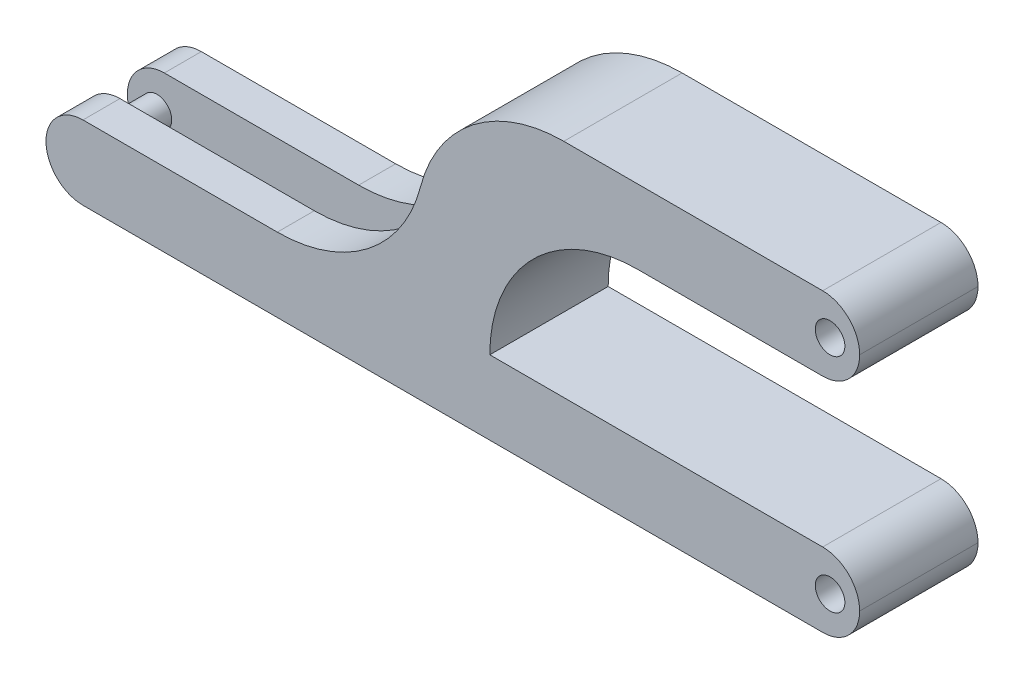
ISO-10303-21;
HEADER;
FILE_DESCRIPTION(('STEP AP214'),'2;1');
FILE_NAME('part.step','',(''),(''),'','','');
FILE_SCHEMA(('AUTOMOTIVE_DESIGN { 1 0 10303 214 1 1 1 1 }'));
ENDSEC;
DATA;
#1=APPLICATION_CONTEXT('core data for automotive mechanical design processes');
#2=APPLICATION_PROTOCOL_DEFINITION('international standard','automotive_design',2000,#1);
#3=PRODUCT_CONTEXT('',#1,'mechanical');
#4=PRODUCT('Part','Part','',(#3));
#5=PRODUCT_RELATED_PRODUCT_CATEGORY('part','',(#4));
#6=PRODUCT_DEFINITION_FORMATION('','',#4);
#7=PRODUCT_DEFINITION_CONTEXT('part definition',#1,'design');
#8=PRODUCT_DEFINITION('design','',#6,#7);
#9=PRODUCT_DEFINITION_SHAPE('','',#8);
#10=(LENGTH_UNIT() NAMED_UNIT(*) SI_UNIT(.MILLI.,.METRE.));
#11=(NAMED_UNIT(*) PLANE_ANGLE_UNIT() SI_UNIT($,.RADIAN.));
#12=(NAMED_UNIT(*) SI_UNIT($,.STERADIAN.) SOLID_ANGLE_UNIT());
#13=UNCERTAINTY_MEASURE_WITH_UNIT(LENGTH_MEASURE(1.E-05),#10,'distance_accuracy_value','');
#14=(GEOMETRIC_REPRESENTATION_CONTEXT(3) GLOBAL_UNCERTAINTY_ASSIGNED_CONTEXT((#13)) GLOBAL_UNIT_ASSIGNED_CONTEXT((#10,
#11,#12)) REPRESENTATION_CONTEXT('',''));
#15=CARTESIAN_POINT('',(0.,0.,0.));
#16=DIRECTION('',(0.,0.,1.));
#17=DIRECTION('',(1.,0.,0.));
#18=AXIS2_PLACEMENT_3D('',#15,#16,#17);
#19=CARTESIAN_POINT('',(0.,-20.,8.));
#20=DIRECTION('',(1.,0.,0.));
#21=DIRECTION('',(0.,1.,0.));
#22=AXIS2_PLACEMENT_3D('',#19,#20,#21);
#23=PLANE('',#22);
#24=DIRECTION('',(0.,-1.,0.));
#25=VECTOR('',#24,1.);
#26=CARTESIAN_POINT('',(0.,-20.,3.));
#27=LINE('',#26,#25);
#28=CARTESIAN_POINT('',(0.,0.,3.));
#29=VERTEX_POINT('',#28);
#30=CARTESIAN_POINT('',(0.,-20.,3.));
#31=VERTEX_POINT('',#30);
#32=EDGE_CURVE('E374',#29,#31,#27,.T.);
#33=ORIENTED_EDGE('',*,*,#32,.F.);
#34=DIRECTION('',(0.,0.,-1.));
#35=VECTOR('',#34,1.);
#36=CARTESIAN_POINT('',(0.,0.,8.));
#37=LINE('',#36,#35);
#38=CARTESIAN_POINT('',(0.,0.,-3.));
#39=VERTEX_POINT('',#38);
#40=EDGE_CURVE('E221',#29,#39,#37,.T.);
#41=ORIENTED_EDGE('',*,*,#40,.T.);
#42=DIRECTION('',(0.,-1.,0.));
#43=VECTOR('',#42,1.);
#44=CARTESIAN_POINT('',(0.,-20.,-3.));
#45=LINE('',#44,#43);
#46=CARTESIAN_POINT('',(0.,-20.,-3.));
#47=VERTEX_POINT('',#46);
#48=EDGE_CURVE('E310',#39,#47,#45,.T.);
#49=ORIENTED_EDGE('',*,*,#48,.T.);
#50=DIRECTION('',(0.,0.,-1.));
#51=VECTOR('',#50,1.);
#52=CARTESIAN_POINT('',(0.,-20.,8.));
#53=LINE('',#52,#51);
#54=EDGE_CURVE('E203',#31,#47,#53,.T.);
#55=ORIENTED_EDGE('',*,*,#54,.F.);
#56=EDGE_LOOP('',(#33,#41,#49,#55));
#57=FACE_BOUND('',#56,.T.);
#58=ADVANCED_FACE('F36',(#57),#23,.F.);
#59=CARTESIAN_POINT('',(0.,0.,8.));
#60=DIRECTION('',(0.,0.,1.));
#61=DIRECTION('',(1.,0.,0.));
#62=AXIS2_PLACEMENT_3D('',#59,#60,#61);
#63=PLANE('',#62);
#64=CARTESIAN_POINT('',(56.,15.,8.));
#65=DIRECTION('',(0.,0.,1.));
#66=DIRECTION('',(1.,0.,0.));
#67=AXIS2_PLACEMENT_3D('',#64,#65,#66);
#68=CIRCLE('',#67,2.);
#69=CARTESIAN_POINT('',(58.,15.,8.));
#70=VERTEX_POINT('',#69);
#71=EDGE_CURVE('E340',#70,#70,#68,.T.);
#72=ORIENTED_EDGE('',*,*,#71,.F.);
#73=EDGE_LOOP('',(#72));
#74=FACE_BOUND('',#73,.T.);
#75=CARTESIAN_POINT('',(55.,15.,8.));
#76=DIRECTION('',(0.,0.,1.));
#77=DIRECTION('',(1.,0.,0.));
#78=AXIS2_PLACEMENT_3D('',#75,#76,#77);
#79=CIRCLE('',#78,5.);
#80=CARTESIAN_POINT('',(55.,10.,8.));
#81=VERTEX_POINT('',#80);
#82=CARTESIAN_POINT('',(60.,15.,8.));
#83=VERTEX_POINT('',#82);
#84=EDGE_CURVE('E283',#81,#83,#79,.T.);
#85=ORIENTED_EDGE('',*,*,#84,.T.);
#86=CARTESIAN_POINT('',(55.,15.,8.));
#87=DIRECTION('',(0.,0.,1.));
#88=DIRECTION('',(1.,0.,0.));
#89=AXIS2_PLACEMENT_3D('',#86,#87,#88);
#90=CIRCLE('',#89,5.);
#91=CARTESIAN_POINT('',(55.,20.,8.));
#92=VERTEX_POINT('',#91);
#93=EDGE_CURVE('E285',#83,#92,#90,.T.);
#94=ORIENTED_EDGE('',*,*,#93,.T.);
#95=DIRECTION('',(-1.,0.,0.));
#96=VECTOR('',#95,1.);
#97=CARTESIAN_POINT('',(60.,20.,8.));
#98=LINE('',#97,#96);
#99=CARTESIAN_POINT('',(19.9999999999999,20.,8.));
#100=VERTEX_POINT('',#99);
#101=EDGE_CURVE('E348',#92,#100,#98,.T.);
#102=ORIENTED_EDGE('',*,*,#101,.T.);
#103=CARTESIAN_POINT('',(19.9999999999999,0.,8.));
#104=DIRECTION('',(0.,0.,1.));
#105=DIRECTION('',(1.,0.,0.));
#106=AXIS2_PLACEMENT_3D('',#103,#104,#105);
#107=CIRCLE('',#106,20.);
#108=CARTESIAN_POINT('',(0.63508326896286,5.,8.));
#109=VERTEX_POINT('',#108);
#110=EDGE_CURVE('E230',#100,#109,#107,.T.);
#111=ORIENTED_EDGE('',*,*,#110,.T.);
#112=CARTESIAN_POINT('',(-18.7298334620742,10.,8.));
#113=DIRECTION('',(0.,0.,1.));
#114=DIRECTION('',(1.,0.,0.));
#115=AXIS2_PLACEMENT_3D('',#112,#113,#114);
#116=CIRCLE('',#115,20.);
#117=CARTESIAN_POINT('',(-18.7298334620742,-10.,8.));
#118=VERTEX_POINT('',#117);
#119=EDGE_CURVE('E252',#109,#118,#116,.F.);
#120=ORIENTED_EDGE('',*,*,#119,.T.);
#121=DIRECTION('',(1.,0.,0.));
#122=VECTOR('',#121,1.);
#123=CARTESIAN_POINT('',(-50.,-10.,8.));
#124=LINE('',#123,#122);
#125=CARTESIAN_POINT('',(-45.,-10.,8.));
#126=VERTEX_POINT('',#125);
#127=EDGE_CURVE('E330',#126,#118,#124,.T.);
#128=ORIENTED_EDGE('',*,*,#127,.F.);
#129=CARTESIAN_POINT('',(-45.,-15.,8.));
#130=DIRECTION('',(0.,0.,1.));
#131=DIRECTION('',(1.,0.,0.));
#132=AXIS2_PLACEMENT_3D('',#129,#130,#131);
#133=CIRCLE('',#132,5.);
#134=CARTESIAN_POINT('',(-50.,-15.,8.));
#135=VERTEX_POINT('',#134);
#136=EDGE_CURVE('E275',#126,#135,#133,.T.);
#137=ORIENTED_EDGE('',*,*,#136,.T.);
#138=CARTESIAN_POINT('',(-45.,-15.,8.));
#139=DIRECTION('',(0.,0.,1.));
#140=DIRECTION('',(1.,0.,0.));
#141=AXIS2_PLACEMENT_3D('',#138,#139,#140);
#142=CIRCLE('',#141,5.);
#143=CARTESIAN_POINT('',(-45.,-20.,8.));
#144=VERTEX_POINT('',#143);
#145=EDGE_CURVE('E277',#135,#144,#142,.T.);
#146=ORIENTED_EDGE('',*,*,#145,.T.);
#147=DIRECTION('',(1.,0.,0.));
#148=VECTOR('',#147,1.);
#149=CARTESIAN_POINT('',(60.,-20.,8.));
#150=LINE('',#149,#148);
#151=CARTESIAN_POINT('',(55.,-20.,8.));
#152=VERTEX_POINT('',#151);
#153=EDGE_CURVE('E350',#144,#152,#150,.T.);
#154=ORIENTED_EDGE('',*,*,#153,.T.);
#155=CARTESIAN_POINT('',(55.,-15.,8.));
#156=DIRECTION('',(0.,0.,1.));
#157=DIRECTION('',(1.,0.,0.));
#158=AXIS2_PLACEMENT_3D('',#155,#156,#157);
#159=CIRCLE('',#158,5.);
#160=CARTESIAN_POINT('',(60.,-15.,8.));
#161=VERTEX_POINT('',#160);
#162=EDGE_CURVE('E281',#152,#161,#159,.T.);
#163=ORIENTED_EDGE('',*,*,#162,.T.);
#164=CARTESIAN_POINT('',(55.,-15.,8.));
#165=DIRECTION('',(0.,0.,1.));
#166=DIRECTION('',(1.,0.,0.));
#167=AXIS2_PLACEMENT_3D('',#164,#165,#166);
#168=CIRCLE('',#167,5.);
#169=CARTESIAN_POINT('',(55.,-10.,8.));
#170=VERTEX_POINT('',#169);
#171=EDGE_CURVE('E279',#161,#170,#168,.T.);
#172=ORIENTED_EDGE('',*,*,#171,.T.);
#173=DIRECTION('',(-1.,0.,0.));
#174=VECTOR('',#173,1.);
#175=CARTESIAN_POINT('',(60.,-10.,8.));
#176=LINE('',#175,#174);
#177=CARTESIAN_POINT('',(9.99999999999999,-10.,8.));
#178=VERTEX_POINT('',#177);
#179=EDGE_CURVE('E210',#170,#178,#176,.T.);
#180=ORIENTED_EDGE('',*,*,#179,.T.);
#181=CARTESIAN_POINT('',(29.9999999999999,-10.,8.));
#182=DIRECTION('',(0.,0.,1.));
#183=DIRECTION('',(1.,0.,0.));
#184=AXIS2_PLACEMENT_3D('',#181,#182,#183);
#185=CIRCLE('',#184,20.);
#186=CARTESIAN_POINT('',(29.9999999999999,10.,8.));
#187=VERTEX_POINT('',#186);
#188=EDGE_CURVE('E199',#178,#187,#185,.F.);
#189=ORIENTED_EDGE('',*,*,#188,.T.);
#190=DIRECTION('',(1.,0.,0.));
#191=VECTOR('',#190,1.);
#192=CARTESIAN_POINT('',(60.,10.,8.));
#193=LINE('',#192,#191);
#194=EDGE_CURVE('E204',#187,#81,#193,.T.);
#195=ORIENTED_EDGE('',*,*,#194,.T.);
#196=EDGE_LOOP('',(#85,#94,#102,#111,#120,#128,#137,#146,#154,#163,#172,#180,#189,#195));
#197=FACE_BOUND('',#196,.T.);
#198=CARTESIAN_POINT('',(56.,-15.,8.));
#199=DIRECTION('',(0.,0.,1.));
#200=DIRECTION('',(1.,0.,0.));
#201=AXIS2_PLACEMENT_3D('',#198,#199,#200);
#202=CIRCLE('',#201,2.);
#203=CARTESIAN_POINT('',(58.,-15.,8.));
#204=VERTEX_POINT('',#203);
#205=EDGE_CURVE('E337',#204,#204,#202,.T.);
#206=ORIENTED_EDGE('',*,*,#205,.F.);
#207=EDGE_LOOP('',(#206));
#208=FACE_BOUND('',#207,.T.);
#209=ADVANCED_FACE('F333',(#74,#197,#208),#63,.T.);
#210=CARTESIAN_POINT('',(60.,20.,8.));
#211=DIRECTION('',(0.,-1.,0.));
#212=DIRECTION('',(1.,0.,0.));
#213=AXIS2_PLACEMENT_3D('',#210,#211,#212);
#214=PLANE('',#213);
#215=ORIENTED_EDGE('',*,*,#101,.F.);
#216=DIRECTION('',(0.,0.,-1.));
#217=VECTOR('',#216,1.);
#218=CARTESIAN_POINT('',(55.,20.,8.));
#219=LINE('',#218,#217);
#220=CARTESIAN_POINT('',(55.,20.,-8.));
#221=VERTEX_POINT('',#220);
#222=EDGE_CURVE('E260',#92,#221,#219,.T.);
#223=ORIENTED_EDGE('',*,*,#222,.T.);
#224=DIRECTION('',(-1.,0.,0.));
#225=VECTOR('',#224,1.);
#226=CARTESIAN_POINT('',(60.,20.,-8.));
#227=LINE('',#226,#225);
#228=CARTESIAN_POINT('',(19.9999999999999,20.,-8.));
#229=VERTEX_POINT('',#228);
#230=EDGE_CURVE('E367',#221,#229,#227,.T.);
#231=ORIENTED_EDGE('',*,*,#230,.T.);
#232=DIRECTION('',(0.,0.,-1.));
#233=VECTOR('',#232,1.);
#234=CARTESIAN_POINT('',(19.9999999999999,20.,8.));
#235=LINE('',#234,#233);
#236=EDGE_CURVE('E227',#229,#100,#235,.F.);
#237=ORIENTED_EDGE('',*,*,#236,.T.);
#238=EDGE_LOOP('',(#215,#223,#231,#237));
#239=FACE_BOUND('',#238,.T.);
#240=ADVANCED_FACE('F419',(#239),#214,.F.);
#241=CARTESIAN_POINT('',(60.,-20.,8.));
#242=DIRECTION('',(0.,1.,0.));
#243=DIRECTION('',(0.,0.,1.));
#244=AXIS2_PLACEMENT_3D('',#241,#242,#243);
#245=PLANE('',#244);
#246=DIRECTION('',(1.,0.,0.));
#247=VECTOR('',#246,1.);
#248=CARTESIAN_POINT('',(60.,-20.,-8.));
#249=LINE('',#248,#247);
#250=CARTESIAN_POINT('',(-45.,-20.,-8.));
#251=VERTEX_POINT('',#250);
#252=CARTESIAN_POINT('',(55.,-20.,-8.));
#253=VERTEX_POINT('',#252);
#254=EDGE_CURVE('E188',#251,#253,#249,.T.);
#255=ORIENTED_EDGE('',*,*,#254,.T.);
#256=DIRECTION('',(0.,0.,-1.));
#257=VECTOR('',#256,1.);
#258=CARTESIAN_POINT('',(55.,-20.,8.));
#259=LINE('',#258,#257);
#260=EDGE_CURVE('E295',#253,#152,#259,.F.);
#261=ORIENTED_EDGE('',*,*,#260,.T.);
#262=ORIENTED_EDGE('',*,*,#153,.F.);
#263=DIRECTION('',(0.,0.,1.));
#264=VECTOR('',#263,1.);
#265=CARTESIAN_POINT('',(-45.,-20.,3.));
#266=LINE('',#265,#264);
#267=CARTESIAN_POINT('',(-45.,-20.,3.));
#268=VERTEX_POINT('',#267);
#269=EDGE_CURVE('E289',#144,#268,#266,.F.);
#270=ORIENTED_EDGE('',*,*,#269,.T.);
#271=DIRECTION('',(1.,0.,0.));
#272=VECTOR('',#271,1.);
#273=CARTESIAN_POINT('',(-50.,-20.,3.));
#274=LINE('',#273,#272);
#275=EDGE_CURVE('E342',#268,#31,#274,.T.);
#276=ORIENTED_EDGE('',*,*,#275,.T.);
#277=ORIENTED_EDGE('',*,*,#54,.T.);
#278=DIRECTION('',(1.,0.,0.));
#279=VECTOR('',#278,1.);
#280=CARTESIAN_POINT('',(-50.,-20.,-3.));
#281=LINE('',#280,#279);
#282=CARTESIAN_POINT('',(-45.,-20.,-3.));
#283=VERTEX_POINT('',#282);
#284=EDGE_CURVE('E385',#283,#47,#281,.T.);
#285=ORIENTED_EDGE('',*,*,#284,.F.);
#286=DIRECTION('',(0.,0.,-1.));
#287=VECTOR('',#286,1.);
#288=CARTESIAN_POINT('',(-45.,-20.,-8.));
#289=LINE('',#288,#287);
#290=EDGE_CURVE('E292',#283,#251,#289,.T.);
#291=ORIENTED_EDGE('',*,*,#290,.T.);
#292=EDGE_LOOP('',(#255,#261,#262,#270,#276,#277,#285,#291));
#293=FACE_BOUND('',#292,.T.);
#294=ADVANCED_FACE('F363',(#293),#245,.F.);
#295=CARTESIAN_POINT('',(60.,-10.,8.));
#296=DIRECTION('',(0.,-1.,0.));
#297=DIRECTION('',(1.,0.,0.));
#298=AXIS2_PLACEMENT_3D('',#295,#296,#297);
#299=PLANE('',#298);
#300=ORIENTED_EDGE('',*,*,#179,.F.);
#301=DIRECTION('',(0.,0.,-1.));
#302=VECTOR('',#301,1.);
#303=CARTESIAN_POINT('',(55.,-10.,8.));
#304=LINE('',#303,#302);
#305=CARTESIAN_POINT('',(55.,-10.,-8.));
#306=VERTEX_POINT('',#305);
#307=EDGE_CURVE('E185',#170,#306,#304,.T.);
#308=ORIENTED_EDGE('',*,*,#307,.T.);
#309=DIRECTION('',(-1.,0.,0.));
#310=VECTOR('',#309,1.);
#311=CARTESIAN_POINT('',(60.,-10.,-8.));
#312=LINE('',#311,#310);
#313=CARTESIAN_POINT('',(9.99999999999999,-10.,-8.));
#314=VERTEX_POINT('',#313);
#315=EDGE_CURVE('E177',#306,#314,#312,.T.);
#316=ORIENTED_EDGE('',*,*,#315,.T.);
#317=DIRECTION('',(0.,0.,-1.));
#318=VECTOR('',#317,1.);
#319=CARTESIAN_POINT('',(9.99999999999999,-10.,8.));
#320=LINE('',#319,#318);
#321=EDGE_CURVE('E182',#178,#314,#320,.T.);
#322=ORIENTED_EDGE('',*,*,#321,.F.);
#323=EDGE_LOOP('',(#300,#308,#316,#322));
#324=FACE_BOUND('',#323,.T.);
#325=ADVANCED_FACE('F180',(#324),#299,.F.);
#326=CARTESIAN_POINT('',(60.,10.,8.));
#327=DIRECTION('',(0.,1.,0.));
#328=DIRECTION('',(-1.,0.,0.));
#329=AXIS2_PLACEMENT_3D('',#326,#327,#328);
#330=PLANE('',#329);
#331=DIRECTION('',(1.,0.,0.));
#332=VECTOR('',#331,1.);
#333=CARTESIAN_POINT('',(60.,10.,-8.));
#334=LINE('',#333,#332);
#335=CARTESIAN_POINT('',(29.9999999999999,10.,-8.));
#336=VERTEX_POINT('',#335);
#337=CARTESIAN_POINT('',(55.,10.,-8.));
#338=VERTEX_POINT('',#337);
#339=EDGE_CURVE('E189',#336,#338,#334,.T.);
#340=ORIENTED_EDGE('',*,*,#339,.T.);
#341=DIRECTION('',(0.,0.,-1.));
#342=VECTOR('',#341,1.);
#343=CARTESIAN_POINT('',(55.,10.,8.));
#344=LINE('',#343,#342);
#345=EDGE_CURVE('E287',#338,#81,#344,.F.);
#346=ORIENTED_EDGE('',*,*,#345,.T.);
#347=ORIENTED_EDGE('',*,*,#194,.F.);
#348=DIRECTION('',(0.,0.,-1.));
#349=VECTOR('',#348,1.);
#350=CARTESIAN_POINT('',(29.9999999999999,10.,-8.));
#351=LINE('',#350,#349);
#352=EDGE_CURVE('E200',#187,#336,#351,.T.);
#353=ORIENTED_EDGE('',*,*,#352,.T.);
#354=EDGE_LOOP('',(#340,#346,#347,#353));
#355=FACE_BOUND('',#354,.T.);
#356=ADVANCED_FACE('F431',(#355),#330,.F.);
#357=CARTESIAN_POINT('',(56.,15.,8.));
#358=DIRECTION('',(0.,0.,-1.));
#359=DIRECTION('',(-1.,0.,0.));
#360=AXIS2_PLACEMENT_3D('',#357,#358,#359);
#361=CYLINDRICAL_SURFACE('',#360,2.);
#362=ORIENTED_EDGE('',*,*,#71,.T.);
#363=EDGE_LOOP('',(#362));
#364=FACE_BOUND('',#363,.T.);
#365=CARTESIAN_POINT('',(56.,15.,-8.));
#366=DIRECTION('',(0.,0.,1.));
#367=DIRECTION('',(1.,0.,0.));
#368=AXIS2_PLACEMENT_3D('',#365,#366,#367);
#369=CIRCLE('',#368,2.);
#370=CARTESIAN_POINT('',(58.,15.,-8.));
#371=VERTEX_POINT('',#370);
#372=EDGE_CURVE('E379',#371,#371,#369,.T.);
#373=ORIENTED_EDGE('',*,*,#372,.F.);
#374=EDGE_LOOP('',(#373));
#375=FACE_BOUND('',#374,.T.);
#376=ADVANCED_FACE('F433',(#364,#375),#361,.F.);
#377=CARTESIAN_POINT('',(56.,-15.,8.));
#378=DIRECTION('',(0.,0.,-1.));
#379=DIRECTION('',(-1.,0.,0.));
#380=AXIS2_PLACEMENT_3D('',#377,#378,#379);
#381=CYLINDRICAL_SURFACE('',#380,2.);
#382=ORIENTED_EDGE('',*,*,#205,.T.);
#383=EDGE_LOOP('',(#382));
#384=FACE_BOUND('',#383,.T.);
#385=CARTESIAN_POINT('',(56.,-15.,-8.));
#386=DIRECTION('',(0.,0.,1.));
#387=DIRECTION('',(1.,0.,0.));
#388=AXIS2_PLACEMENT_3D('',#385,#386,#387);
#389=CIRCLE('',#388,2.);
#390=CARTESIAN_POINT('',(58.,-15.,-8.));
#391=VERTEX_POINT('',#390);
#392=EDGE_CURVE('E382',#391,#391,#389,.T.);
#393=ORIENTED_EDGE('',*,*,#392,.F.);
#394=EDGE_LOOP('',(#393));
#395=FACE_BOUND('',#394,.T.);
#396=ADVANCED_FACE('F439',(#384,#395),#381,.F.);
#397=CARTESIAN_POINT('',(-50.,-10.,8.));
#398=DIRECTION('',(0.,-1.,0.));
#399=DIRECTION('',(0.,0.,-1.));
#400=AXIS2_PLACEMENT_3D('',#397,#398,#399);
#401=PLANE('',#400);
#402=DIRECTION('',(1.,0.,0.));
#403=VECTOR('',#402,1.);
#404=CARTESIAN_POINT('',(-50.,-10.,3.));
#405=LINE('',#404,#403);
#406=CARTESIAN_POINT('',(-45.,-10.,3.));
#407=VERTEX_POINT('',#406);
#408=CARTESIAN_POINT('',(-18.7298334620742,-10.,3.));
#409=VERTEX_POINT('',#408);
#410=EDGE_CURVE('E331',#407,#409,#405,.T.);
#411=ORIENTED_EDGE('',*,*,#410,.F.);
#412=DIRECTION('',(0.,0.,-1.));
#413=VECTOR('',#412,1.);
#414=CARTESIAN_POINT('',(-45.,-10.,8.));
#415=LINE('',#414,#413);
#416=EDGE_CURVE('E11',#407,#126,#415,.F.);
#417=ORIENTED_EDGE('',*,*,#416,.T.);
#418=ORIENTED_EDGE('',*,*,#127,.T.);
#419=DIRECTION('',(0.,0.,-1.));
#420=VECTOR('',#419,1.);
#421=CARTESIAN_POINT('',(-18.7298334620742,-10.,8.));
#422=LINE('',#421,#420);
#423=EDGE_CURVE('E233',#118,#409,#422,.T.);
#424=ORIENTED_EDGE('',*,*,#423,.T.);
#425=EDGE_LOOP('',(#411,#417,#418,#424));
#426=FACE_BOUND('',#425,.T.);
#427=ADVANCED_FACE('F329',(#426),#401,.F.);
#428=CARTESIAN_POINT('',(-50.,-20.,3.));
#429=DIRECTION('',(0.,0.,1.));
#430=DIRECTION('',(0.,-1.,0.));
#431=AXIS2_PLACEMENT_3D('',#428,#429,#430);
#432=PLANE('',#431);
#433=CARTESIAN_POINT('',(-46.,-15.,3.));
#434=DIRECTION('',(0.,0.,1.));
#435=DIRECTION('',(0.,-1.,0.));
#436=AXIS2_PLACEMENT_3D('',#433,#434,#435);
#437=CIRCLE('',#436,2.);
#438=CARTESIAN_POINT('',(-46.,-17.,3.));
#439=VERTEX_POINT('',#438);
#440=EDGE_CURVE('E207',#439,#439,#437,.F.);
#441=ORIENTED_EDGE('',*,*,#440,.F.);
#442=EDGE_LOOP('',(#441));
#443=FACE_BOUND('',#442,.T.);
#444=ORIENTED_EDGE('',*,*,#275,.F.);
#445=CARTESIAN_POINT('',(-45.,-15.,3.));
#446=DIRECTION('',(0.,0.,1.));
#447=DIRECTION('',(0.,-1.,0.));
#448=AXIS2_PLACEMENT_3D('',#445,#446,#447);
#449=CIRCLE('',#448,5.);
#450=CARTESIAN_POINT('',(-50.,-15.,3.));
#451=VERTEX_POINT('',#450);
#452=EDGE_CURVE('E45',#268,#451,#449,.F.);
#453=ORIENTED_EDGE('',*,*,#452,.T.);
#454=CARTESIAN_POINT('',(-45.,-15.,3.));
#455=DIRECTION('',(0.,0.,1.));
#456=DIRECTION('',(0.,-1.,0.));
#457=AXIS2_PLACEMENT_3D('',#454,#455,#456);
#458=CIRCLE('',#457,5.);
#459=EDGE_CURVE('E53',#451,#407,#458,.F.);
#460=ORIENTED_EDGE('',*,*,#459,.T.);
#461=ORIENTED_EDGE('',*,*,#410,.T.);
#462=CARTESIAN_POINT('',(-18.7298334620742,10.,3.));
#463=DIRECTION('',(0.,0.,1.));
#464=DIRECTION('',(0.,-1.,0.));
#465=AXIS2_PLACEMENT_3D('',#462,#463,#464);
#466=CIRCLE('',#465,20.);
#467=CARTESIAN_POINT('',(0.635083268962862,5.,3.));
#468=VERTEX_POINT('',#467);
#469=EDGE_CURVE('E250',#409,#468,#466,.T.);
#470=ORIENTED_EDGE('',*,*,#469,.T.);
#471=CARTESIAN_POINT('',(19.9999999999999,0.,3.));
#472=DIRECTION('',(0.,0.,1.));
#473=DIRECTION('',(0.,-1.,0.));
#474=AXIS2_PLACEMENT_3D('',#471,#472,#473);
#475=CIRCLE('',#474,20.);
#476=EDGE_CURVE('E244',#29,#468,#475,.F.);
#477=ORIENTED_EDGE('',*,*,#476,.F.);
#478=ORIENTED_EDGE('',*,*,#32,.T.);
#479=EDGE_LOOP('',(#444,#453,#460,#461,#470,#477,#478));
#480=FACE_BOUND('',#479,.T.);
#481=ADVANCED_FACE('F372',(#443,#480),#432,.F.);
#482=CARTESIAN_POINT('',(-46.,-15.,-2.));
#483=DIRECTION('',(0.,0.,1.));
#484=DIRECTION('',(1.,0.,0.));
#485=AXIS2_PLACEMENT_3D('',#482,#483,#484);
#486=CYLINDRICAL_SURFACE('',#485,2.);
#487=ORIENTED_EDGE('',*,*,#440,.T.);
#488=EDGE_LOOP('',(#487));
#489=FACE_BOUND('',#488,.T.);
#490=CARTESIAN_POINT('',(-46.,-15.,-3.));
#491=DIRECTION('',(0.,0.,1.));
#492=DIRECTION('',(0.,-1.,0.));
#493=AXIS2_PLACEMENT_3D('',#490,#491,#492);
#494=CIRCLE('',#493,2.);
#495=CARTESIAN_POINT('',(-46.,-17.,-3.));
#496=VERTEX_POINT('',#495);
#497=EDGE_CURVE('E216',#496,#496,#494,.T.);
#498=ORIENTED_EDGE('',*,*,#497,.T.);
#499=EDGE_LOOP('',(#498));
#500=FACE_BOUND('',#499,.T.);
#501=ADVANCED_FACE('F542',(#489,#500),#486,.T.);
#502=CARTESIAN_POINT('',(0.,0.,-8.));
#503=DIRECTION('',(0.,0.,-1.));
#504=DIRECTION('',(1.,0.,0.));
#505=AXIS2_PLACEMENT_3D('',#502,#503,#504);
#506=PLANE('',#505);
#507=ORIENTED_EDGE('',*,*,#392,.T.);
#508=EDGE_LOOP('',(#507));
#509=FACE_BOUND('',#508,.T.);
#510=ORIENTED_EDGE('',*,*,#372,.T.);
#511=EDGE_LOOP('',(#510));
#512=FACE_BOUND('',#511,.T.);
#513=ORIENTED_EDGE('',*,*,#230,.F.);
#514=CARTESIAN_POINT('',(55.,15.,-8.));
#515=DIRECTION('',(0.,0.,-1.));
#516=DIRECTION('',(-1.,0.,0.));
#517=AXIS2_PLACEMENT_3D('',#514,#515,#516);
#518=CIRCLE('',#517,5.);
#519=CARTESIAN_POINT('',(60.,15.,-8.));
#520=VERTEX_POINT('',#519);
#521=EDGE_CURVE('E273',#221,#520,#518,.T.);
#522=ORIENTED_EDGE('',*,*,#521,.T.);
#523=CARTESIAN_POINT('',(55.,15.,-8.));
#524=DIRECTION('',(0.,0.,-1.));
#525=DIRECTION('',(-1.,0.,0.));
#526=AXIS2_PLACEMENT_3D('',#523,#524,#525);
#527=CIRCLE('',#526,5.);
#528=EDGE_CURVE('E271',#520,#338,#527,.T.);
#529=ORIENTED_EDGE('',*,*,#528,.T.);
#530=ORIENTED_EDGE('',*,*,#339,.F.);
#531=CARTESIAN_POINT('',(29.9999999999999,-10.,-8.));
#532=DIRECTION('',(0.,0.,-1.));
#533=DIRECTION('',(-1.,0.,0.));
#534=AXIS2_PLACEMENT_3D('',#531,#532,#533);
#535=CIRCLE('',#534,20.);
#536=EDGE_CURVE('E192',#336,#314,#535,.F.);
#537=ORIENTED_EDGE('',*,*,#536,.T.);
#538=ORIENTED_EDGE('',*,*,#315,.F.);
#539=CARTESIAN_POINT('',(55.,-15.,-8.));
#540=DIRECTION('',(0.,0.,-1.));
#541=DIRECTION('',(-1.,0.,0.));
#542=AXIS2_PLACEMENT_3D('',#539,#540,#541);
#543=CIRCLE('',#542,5.);
#544=CARTESIAN_POINT('',(60.,-15.,-8.));
#545=VERTEX_POINT('',#544);
#546=EDGE_CURVE('E267',#306,#545,#543,.T.);
#547=ORIENTED_EDGE('',*,*,#546,.T.);
#548=CARTESIAN_POINT('',(55.,-15.,-8.));
#549=DIRECTION('',(0.,0.,-1.));
#550=DIRECTION('',(-1.,0.,0.));
#551=AXIS2_PLACEMENT_3D('',#548,#549,#550);
#552=CIRCLE('',#551,5.);
#553=EDGE_CURVE('E269',#545,#253,#552,.T.);
#554=ORIENTED_EDGE('',*,*,#553,.T.);
#555=ORIENTED_EDGE('',*,*,#254,.F.);
#556=CARTESIAN_POINT('',(-45.,-15.,-8.));
#557=DIRECTION('',(0.,0.,-1.));
#558=DIRECTION('',(-1.,0.,0.));
#559=AXIS2_PLACEMENT_3D('',#556,#557,#558);
#560=CIRCLE('',#559,5.);
#561=CARTESIAN_POINT('',(-50.,-15.,-8.));
#562=VERTEX_POINT('',#561);
#563=EDGE_CURVE('E265',#251,#562,#560,.T.);
#564=ORIENTED_EDGE('',*,*,#563,.T.);
#565=CARTESIAN_POINT('',(-45.,-15.,-8.));
#566=DIRECTION('',(0.,0.,-1.));
#567=DIRECTION('',(-1.,0.,0.));
#568=AXIS2_PLACEMENT_3D('',#565,#566,#567);
#569=CIRCLE('',#568,5.);
#570=CARTESIAN_POINT('',(-45.,-10.,-8.));
#571=VERTEX_POINT('',#570);
#572=EDGE_CURVE('E263',#562,#571,#569,.T.);
#573=ORIENTED_EDGE('',*,*,#572,.T.);
#574=DIRECTION('',(1.,0.,0.));
#575=VECTOR('',#574,1.);
#576=CARTESIAN_POINT('',(-50.,-10.,-8.));
#577=LINE('',#576,#575);
#578=CARTESIAN_POINT('',(-18.7298334620742,-10.,-8.));
#579=VERTEX_POINT('',#578);
#580=EDGE_CURVE('E389',#571,#579,#577,.T.);
#581=ORIENTED_EDGE('',*,*,#580,.T.);
#582=CARTESIAN_POINT('',(-18.7298334620742,10.,-8.));
#583=DIRECTION('',(0.,0.,-1.));
#584=DIRECTION('',(-1.,0.,0.));
#585=AXIS2_PLACEMENT_3D('',#582,#583,#584);
#586=CIRCLE('',#585,20.);
#587=CARTESIAN_POINT('',(0.63508326896286,5.,-8.));
#588=VERTEX_POINT('',#587);
#589=EDGE_CURVE('E258',#579,#588,#586,.F.);
#590=ORIENTED_EDGE('',*,*,#589,.T.);
#591=CARTESIAN_POINT('',(19.9999999999999,0.,-8.));
#592=DIRECTION('',(0.,0.,-1.));
#593=DIRECTION('',(-1.,0.,0.));
#594=AXIS2_PLACEMENT_3D('',#591,#592,#593);
#595=CIRCLE('',#594,20.);
#596=EDGE_CURVE('E224',#588,#229,#595,.T.);
#597=ORIENTED_EDGE('',*,*,#596,.T.);
#598=EDGE_LOOP('',(#513,#522,#529,#530,#537,#538,#547,#554,#555,#564,#573,#581,#590,#597));
#599=FACE_BOUND('',#598,.T.);
#600=ADVANCED_FACE('F194',(#509,#512,#599),#506,.T.);
#601=CARTESIAN_POINT('',(-50.,-20.,-3.));
#602=DIRECTION('',(0.,0.,1.));
#603=DIRECTION('',(0.,-1.,0.));
#604=AXIS2_PLACEMENT_3D('',#601,#602,#603);
#605=PLANE('',#604);
#606=ORIENTED_EDGE('',*,*,#497,.F.);
#607=EDGE_LOOP('',(#606));
#608=FACE_BOUND('',#607,.T.);
#609=CARTESIAN_POINT('',(-45.,-15.,-3.));
#610=DIRECTION('',(0.,0.,1.));
#611=DIRECTION('',(0.,-1.,0.));
#612=AXIS2_PLACEMENT_3D('',#609,#610,#611);
#613=CIRCLE('',#612,5.);
#614=CARTESIAN_POINT('',(-45.,-10.,-3.));
#615=VERTEX_POINT('',#614);
#616=CARTESIAN_POINT('',(-50.,-15.,-3.));
#617=VERTEX_POINT('',#616);
#618=EDGE_CURVE('E299',#615,#617,#613,.T.);
#619=ORIENTED_EDGE('',*,*,#618,.T.);
#620=CARTESIAN_POINT('',(-45.,-15.,-3.));
#621=DIRECTION('',(0.,0.,1.));
#622=DIRECTION('',(0.,-1.,0.));
#623=AXIS2_PLACEMENT_3D('',#620,#621,#622);
#624=CIRCLE('',#623,5.);
#625=EDGE_CURVE('E301',#617,#283,#624,.T.);
#626=ORIENTED_EDGE('',*,*,#625,.T.);
#627=ORIENTED_EDGE('',*,*,#284,.T.);
#628=ORIENTED_EDGE('',*,*,#48,.F.);
#629=CARTESIAN_POINT('',(19.9999999999999,0.,-3.));
#630=DIRECTION('',(0.,0.,1.));
#631=DIRECTION('',(0.,-1.,0.));
#632=AXIS2_PLACEMENT_3D('',#629,#630,#631);
#633=CIRCLE('',#632,20.);
#634=CARTESIAN_POINT('',(0.635083268962862,5.,-3.));
#635=VERTEX_POINT('',#634);
#636=EDGE_CURVE('E236',#635,#39,#633,.T.);
#637=ORIENTED_EDGE('',*,*,#636,.F.);
#638=CARTESIAN_POINT('',(-18.7298334620742,10.,-3.));
#639=DIRECTION('',(0.,0.,1.));
#640=DIRECTION('',(0.,-1.,0.));
#641=AXIS2_PLACEMENT_3D('',#638,#639,#640);
#642=CIRCLE('',#641,20.);
#643=CARTESIAN_POINT('',(-18.7298334620742,-10.,-3.));
#644=VERTEX_POINT('',#643);
#645=EDGE_CURVE('E255',#635,#644,#642,.F.);
#646=ORIENTED_EDGE('',*,*,#645,.T.);
#647=DIRECTION('',(1.,0.,0.));
#648=VECTOR('',#647,1.);
#649=CARTESIAN_POINT('',(-50.,-10.,-3.));
#650=LINE('',#649,#648);
#651=EDGE_CURVE('E387',#615,#644,#650,.T.);
#652=ORIENTED_EDGE('',*,*,#651,.F.);
#653=EDGE_LOOP('',(#619,#626,#627,#628,#637,#646,#652));
#654=FACE_BOUND('',#653,.T.);
#655=ADVANCED_FACE('F406',(#608,#654),#605,.T.);
#656=CARTESIAN_POINT('',(-50.,-10.,-8.));
#657=DIRECTION('',(0.,1.,0.));
#658=DIRECTION('',(0.,0.,1.));
#659=AXIS2_PLACEMENT_3D('',#656,#657,#658);
#660=PLANE('',#659);
#661=ORIENTED_EDGE('',*,*,#580,.F.);
#662=DIRECTION('',(0.,0.,1.));
#663=VECTOR('',#662,1.);
#664=CARTESIAN_POINT('',(-45.,-10.,-8.));
#665=LINE('',#664,#663);
#666=EDGE_CURVE('E303',#571,#615,#665,.T.);
#667=ORIENTED_EDGE('',*,*,#666,.T.);
#668=ORIENTED_EDGE('',*,*,#651,.T.);
#669=DIRECTION('',(0.,0.,1.));
#670=VECTOR('',#669,1.);
#671=CARTESIAN_POINT('',(-18.7298334620742,-10.,-8.));
#672=LINE('',#671,#670);
#673=EDGE_CURVE('E247',#644,#579,#672,.F.);
#674=ORIENTED_EDGE('',*,*,#673,.T.);
#675=EDGE_LOOP('',(#661,#667,#668,#674));
#676=FACE_BOUND('',#675,.T.);
#677=ADVANCED_FACE('F405',(#676),#660,.T.);
#678=CARTESIAN_POINT('',(29.9999999999999,-10.,8.));
#679=DIRECTION('',(0.,0.,1.));
#680=DIRECTION('',(1.,0.,0.));
#681=AXIS2_PLACEMENT_3D('',#678,#679,#680);
#682=CYLINDRICAL_SURFACE('',#681,20.);
#683=ORIENTED_EDGE('',*,*,#188,.F.);
#684=ORIENTED_EDGE('',*,*,#321,.T.);
#685=ORIENTED_EDGE('',*,*,#536,.F.);
#686=ORIENTED_EDGE('',*,*,#352,.F.);
#687=EDGE_LOOP('',(#683,#684,#685,#686));
#688=FACE_BOUND('',#687,.T.);
#689=ADVANCED_FACE('F202',(#688),#682,.F.);
#690=CARTESIAN_POINT('',(19.9999999999999,0.,8.));
#691=DIRECTION('',(0.,0.,-1.));
#692=DIRECTION('',(-1.,0.,0.));
#693=AXIS2_PLACEMENT_3D('',#690,#691,#692);
#694=CYLINDRICAL_SURFACE('',#693,20.);
#695=ORIENTED_EDGE('',*,*,#40,.F.);
#696=ORIENTED_EDGE('',*,*,#476,.T.);
#697=DIRECTION('',(0.,0.,-1.));
#698=VECTOR('',#697,1.);
#699=CARTESIAN_POINT('',(0.63508326896286,5.,8.));
#700=LINE('',#699,#698);
#701=EDGE_CURVE('E242',#468,#109,#700,.F.);
#702=ORIENTED_EDGE('',*,*,#701,.T.);
#703=ORIENTED_EDGE('',*,*,#110,.F.);
#704=ORIENTED_EDGE('',*,*,#236,.F.);
#705=ORIENTED_EDGE('',*,*,#596,.F.);
#706=DIRECTION('',(0.,0.,-1.));
#707=VECTOR('',#706,1.);
#708=CARTESIAN_POINT('',(0.63508326896286,5.,8.));
#709=LINE('',#708,#707);
#710=EDGE_CURVE('E239',#588,#635,#709,.F.);
#711=ORIENTED_EDGE('',*,*,#710,.T.);
#712=ORIENTED_EDGE('',*,*,#636,.T.);
#713=EDGE_LOOP('',(#695,#696,#702,#703,#704,#705,#711,#712));
#714=FACE_BOUND('',#713,.T.);
#715=ADVANCED_FACE('F415',(#714),#694,.T.);
#716=CARTESIAN_POINT('',(-18.7298334620742,10.,8.));
#717=DIRECTION('',(0.,0.,-1.));
#718=DIRECTION('',(-1.,0.,0.));
#719=AXIS2_PLACEMENT_3D('',#716,#717,#718);
#720=CYLINDRICAL_SURFACE('',#719,20.);
#721=ORIENTED_EDGE('',*,*,#119,.F.);
#722=ORIENTED_EDGE('',*,*,#701,.F.);
#723=ORIENTED_EDGE('',*,*,#469,.F.);
#724=ORIENTED_EDGE('',*,*,#423,.F.);
#725=EDGE_LOOP('',(#721,#722,#723,#724));
#726=FACE_BOUND('',#725,.T.);
#727=ADVANCED_FACE('F458',(#726),#720,.F.);
#728=CARTESIAN_POINT('',(-18.7298334620742,10.,8.));
#729=DIRECTION('',(0.,0.,-1.));
#730=DIRECTION('',(-1.,0.,0.));
#731=AXIS2_PLACEMENT_3D('',#728,#729,#730);
#732=CYLINDRICAL_SURFACE('',#731,20.);
#733=ORIENTED_EDGE('',*,*,#589,.F.);
#734=ORIENTED_EDGE('',*,*,#673,.F.);
#735=ORIENTED_EDGE('',*,*,#645,.F.);
#736=ORIENTED_EDGE('',*,*,#710,.F.);
#737=EDGE_LOOP('',(#733,#734,#735,#736));
#738=FACE_BOUND('',#737,.T.);
#739=ADVANCED_FACE('F411',(#738),#732,.F.);
#740=CARTESIAN_POINT('',(55.,15.,8.));
#741=DIRECTION('',(0.,0.,-1.));
#742=DIRECTION('',(-1.,0.,0.));
#743=AXIS2_PLACEMENT_3D('',#740,#741,#742);
#744=CYLINDRICAL_SURFACE('',#743,5.);
#745=DIRECTION('',(0.,0.,-1.));
#746=VECTOR('',#745,1.);
#747=CARTESIAN_POINT('',(60.,15.,8.));
#748=LINE('',#747,#746);
#749=EDGE_CURVE('E307',#83,#520,#748,.T.);
#750=ORIENTED_EDGE('',*,*,#749,.F.);
#751=ORIENTED_EDGE('',*,*,#84,.F.);
#752=ORIENTED_EDGE('',*,*,#345,.F.);
#753=ORIENTED_EDGE('',*,*,#528,.F.);
#754=EDGE_LOOP('',(#750,#751,#752,#753));
#755=FACE_BOUND('',#754,.T.);
#756=ADVANCED_FACE('F426',(#755),#744,.T.);
#757=CARTESIAN_POINT('',(55.,15.,8.));
#758=DIRECTION('',(0.,0.,-1.));
#759=DIRECTION('',(-1.,0.,0.));
#760=AXIS2_PLACEMENT_3D('',#757,#758,#759);
#761=CYLINDRICAL_SURFACE('',#760,5.);
#762=ORIENTED_EDGE('',*,*,#93,.F.);
#763=ORIENTED_EDGE('',*,*,#749,.T.);
#764=ORIENTED_EDGE('',*,*,#521,.F.);
#765=ORIENTED_EDGE('',*,*,#222,.F.);
#766=EDGE_LOOP('',(#762,#763,#764,#765));
#767=FACE_BOUND('',#766,.T.);
#768=ADVANCED_FACE('F429',(#767),#761,.T.);
#769=CARTESIAN_POINT('',(55.,-15.,8.));
#770=DIRECTION('',(0.,0.,-1.));
#771=DIRECTION('',(-1.,0.,0.));
#772=AXIS2_PLACEMENT_3D('',#769,#770,#771);
#773=CYLINDRICAL_SURFACE('',#772,5.);
#774=ORIENTED_EDGE('',*,*,#307,.F.);
#775=ORIENTED_EDGE('',*,*,#171,.F.);
#776=DIRECTION('',(0.,0.,-1.));
#777=VECTOR('',#776,1.);
#778=CARTESIAN_POINT('',(60.,-15.,8.));
#779=LINE('',#778,#777);
#780=EDGE_CURVE('E311',#545,#161,#779,.F.);
#781=ORIENTED_EDGE('',*,*,#780,.F.);
#782=ORIENTED_EDGE('',*,*,#546,.F.);
#783=EDGE_LOOP('',(#774,#775,#781,#782));
#784=FACE_BOUND('',#783,.T.);
#785=ADVANCED_FACE('F355',(#784),#773,.T.);
#786=CARTESIAN_POINT('',(55.,-15.,8.));
#787=DIRECTION('',(0.,0.,-1.));
#788=DIRECTION('',(-1.,0.,0.));
#789=AXIS2_PLACEMENT_3D('',#786,#787,#788);
#790=CYLINDRICAL_SURFACE('',#789,5.);
#791=ORIENTED_EDGE('',*,*,#162,.F.);
#792=ORIENTED_EDGE('',*,*,#260,.F.);
#793=ORIENTED_EDGE('',*,*,#553,.F.);
#794=ORIENTED_EDGE('',*,*,#780,.T.);
#795=EDGE_LOOP('',(#791,#792,#793,#794));
#796=FACE_BOUND('',#795,.T.);
#797=ADVANCED_FACE('F369',(#796),#790,.T.);
#798=CARTESIAN_POINT('',(-45.,-15.,-8.));
#799=DIRECTION('',(0.,0.,1.));
#800=DIRECTION('',(1.,0.,0.));
#801=AXIS2_PLACEMENT_3D('',#798,#799,#800);
#802=CYLINDRICAL_SURFACE('',#801,5.);
#803=DIRECTION('',(0.,0.,1.));
#804=VECTOR('',#803,1.);
#805=CARTESIAN_POINT('',(-50.,-15.,0.));
#806=LINE('',#805,#804);
#807=EDGE_CURVE('E313',#617,#562,#806,.F.);
#808=ORIENTED_EDGE('',*,*,#807,.F.);
#809=ORIENTED_EDGE('',*,*,#618,.F.);
#810=ORIENTED_EDGE('',*,*,#666,.F.);
#811=ORIENTED_EDGE('',*,*,#572,.F.);
#812=EDGE_LOOP('',(#808,#809,#810,#811));
#813=FACE_BOUND('',#812,.T.);
#814=ADVANCED_FACE('F401',(#813),#802,.T.);
#815=CARTESIAN_POINT('',(-45.,-15.,8.));
#816=DIRECTION('',(0.,0.,1.));
#817=DIRECTION('',(1.,0.,0.));
#818=AXIS2_PLACEMENT_3D('',#815,#816,#817);
#819=CYLINDRICAL_SURFACE('',#818,5.);
#820=ORIENTED_EDGE('',*,*,#625,.F.);
#821=ORIENTED_EDGE('',*,*,#807,.T.);
#822=ORIENTED_EDGE('',*,*,#563,.F.);
#823=ORIENTED_EDGE('',*,*,#290,.F.);
#824=EDGE_LOOP('',(#820,#821,#822,#823));
#825=FACE_BOUND('',#824,.T.);
#826=ADVANCED_FACE('F396',(#825),#819,.T.);
#827=CARTESIAN_POINT('',(-45.,-15.,0.));
#828=DIRECTION('',(0.,0.,1.));
#829=DIRECTION('',(1.,0.,0.));
#830=AXIS2_PLACEMENT_3D('',#827,#828,#829);
#831=CYLINDRICAL_SURFACE('',#830,5.);
#832=ORIENTED_EDGE('',*,*,#416,.F.);
#833=ORIENTED_EDGE('',*,*,#459,.F.);
#834=DIRECTION('',(0.,0.,-1.));
#835=VECTOR('',#834,1.);
#836=CARTESIAN_POINT('',(-50.,-15.,3.));
#837=LINE('',#836,#835);
#838=EDGE_CURVE('E40',#135,#451,#837,.T.);
#839=ORIENTED_EDGE('',*,*,#838,.F.);
#840=ORIENTED_EDGE('',*,*,#136,.F.);
#841=EDGE_LOOP('',(#832,#833,#839,#840));
#842=FACE_BOUND('',#841,.T.);
#843=ADVANCED_FACE('F38',(#842),#831,.T.);
#844=CARTESIAN_POINT('',(-45.,-15.,0.));
#845=DIRECTION('',(0.,0.,-1.));
#846=DIRECTION('',(-1.,0.,0.));
#847=AXIS2_PLACEMENT_3D('',#844,#845,#846);
#848=CYLINDRICAL_SURFACE('',#847,5.);
#849=ORIENTED_EDGE('',*,*,#452,.F.);
#850=ORIENTED_EDGE('',*,*,#269,.F.);
#851=ORIENTED_EDGE('',*,*,#145,.F.);
#852=ORIENTED_EDGE('',*,*,#838,.T.);
#853=EDGE_LOOP('',(#849,#850,#851,#852));
#854=FACE_BOUND('',#853,.T.);
#855=ADVANCED_FACE('F322',(#854),#848,.T.);
#856=CLOSED_SHELL('',(#58,#209,#240,#294,#325,#356,#376,#396,#427,#481,#501,#600,#655,#677,#689,
#715,#727,#739,#756,#768,#785,#797,#814,#826,#843,#855));
#857=MANIFOLD_SOLID_BREP('B2',#856);
#858=ADVANCED_BREP_SHAPE_REPRESENTATION('',(#18,#857),#14);
#859=SHAPE_DEFINITION_REPRESENTATION(#9,#858);
ENDSEC;
END-ISO-10303-21;
